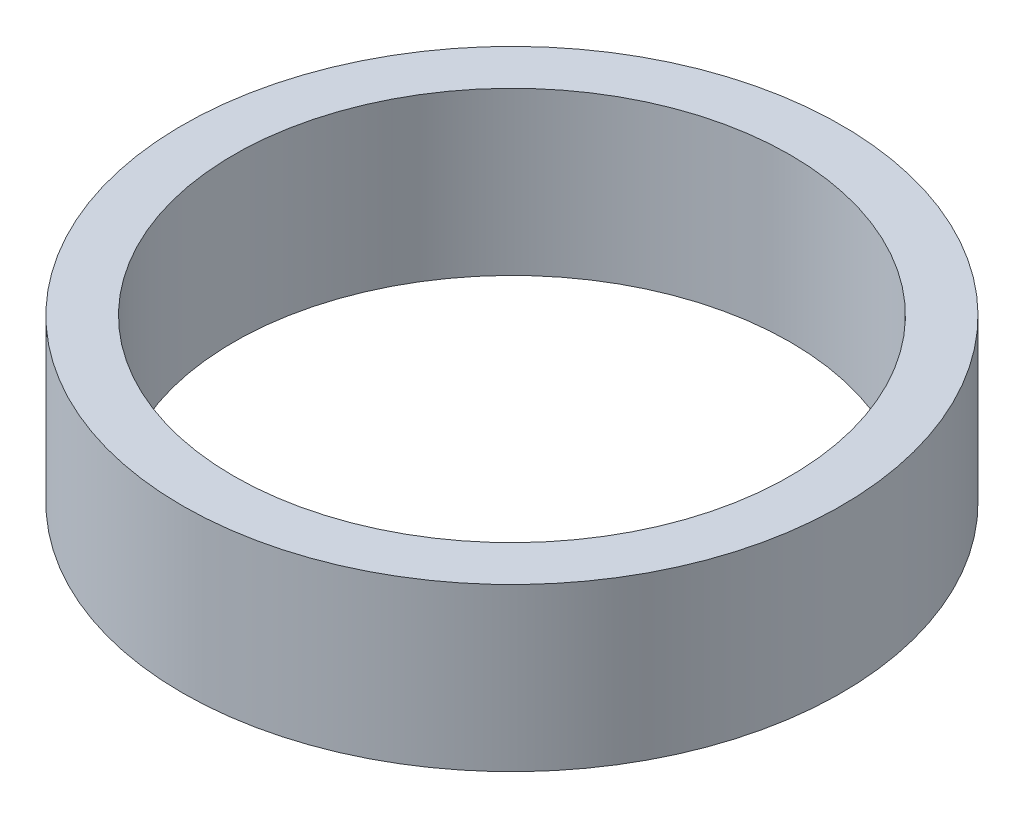
ISO-10303-21;
HEADER;
FILE_DESCRIPTION(('STEP AP214'),'2;1');
FILE_NAME('part.step','',(''),(''),'','','');
FILE_SCHEMA(('AUTOMOTIVE_DESIGN { 1 0 10303 214 1 1 1 1 }'));
ENDSEC;
DATA;
#1=APPLICATION_CONTEXT('core data for automotive mechanical design processes');
#2=APPLICATION_PROTOCOL_DEFINITION('international standard','automotive_design',2000,#1);
#3=PRODUCT_CONTEXT('',#1,'mechanical');
#4=PRODUCT('Part','Part','',(#3));
#5=PRODUCT_RELATED_PRODUCT_CATEGORY('part','',(#4));
#6=PRODUCT_DEFINITION_FORMATION('','',#4);
#7=PRODUCT_DEFINITION_CONTEXT('part definition',#1,'design');
#8=PRODUCT_DEFINITION('design','',#6,#7);
#9=PRODUCT_DEFINITION_SHAPE('','',#8);
#10=(LENGTH_UNIT() NAMED_UNIT(*) SI_UNIT(.MILLI.,.METRE.));
#11=(NAMED_UNIT(*) PLANE_ANGLE_UNIT() SI_UNIT($,.RADIAN.));
#12=(NAMED_UNIT(*) SI_UNIT($,.STERADIAN.) SOLID_ANGLE_UNIT());
#13=UNCERTAINTY_MEASURE_WITH_UNIT(LENGTH_MEASURE(1.E-05),#10,'distance_accuracy_value','');
#14=(GEOMETRIC_REPRESENTATION_CONTEXT(3) GLOBAL_UNCERTAINTY_ASSIGNED_CONTEXT((#13)) GLOBAL_UNIT_ASSIGNED_CONTEXT((#10,
#11,#12)) REPRESENTATION_CONTEXT('',''));
#15=CARTESIAN_POINT('',(0.,0.,0.));
#16=DIRECTION('',(0.,0.,1.));
#17=DIRECTION('',(1.,0.,0.));
#18=AXIS2_PLACEMENT_3D('',#15,#16,#17);
#19=CARTESIAN_POINT('',(0.,3.,0.));
#20=DIRECTION('',(0.,1.,0.));
#21=DIRECTION('',(0.,0.,1.));
#22=AXIS2_PLACEMENT_3D('',#19,#20,#21);
#23=PLANE('',#22);
#24=CARTESIAN_POINT('',(0.,3.,0.));
#25=DIRECTION('',(0.,1.,0.));
#26=DIRECTION('',(0.,0.,1.));
#27=AXIS2_PLACEMENT_3D('',#24,#25,#26);
#28=CIRCLE('',#27,6.1);
#29=CARTESIAN_POINT('',(0.,3.,6.1));
#30=VERTEX_POINT('',#29);
#31=EDGE_CURVE('E10',#30,#30,#28,.T.);
#32=ORIENTED_EDGE('',*,*,#31,.T.);
#33=EDGE_LOOP('',(#32));
#34=FACE_BOUND('',#33,.T.);
#35=CARTESIAN_POINT('',(0.,3.,0.));
#36=DIRECTION('',(0.,1.,0.));
#37=DIRECTION('',(0.,0.,1.));
#38=AXIS2_PLACEMENT_3D('',#35,#36,#37);
#39=CIRCLE('',#38,5.15);
#40=CARTESIAN_POINT('',(0.,3.,5.15));
#41=VERTEX_POINT('',#40);
#42=EDGE_CURVE('E48',#41,#41,#39,.T.);
#43=ORIENTED_EDGE('',*,*,#42,.F.);
#44=EDGE_LOOP('',(#43));
#45=FACE_BOUND('',#44,.T.);
#46=ADVANCED_FACE('F37',(#34,#45),#23,.T.);
#47=CARTESIAN_POINT('',(0.,0.,0.));
#48=DIRECTION('',(0.,1.,0.));
#49=DIRECTION('',(0.,0.,1.));
#50=AXIS2_PLACEMENT_3D('',#47,#48,#49);
#51=PLANE('',#50);
#52=CARTESIAN_POINT('',(0.,0.,0.));
#53=DIRECTION('',(0.,1.,0.));
#54=DIRECTION('',(0.,0.,1.));
#55=AXIS2_PLACEMENT_3D('',#52,#53,#54);
#56=CIRCLE('',#55,6.1);
#57=CARTESIAN_POINT('',(0.,0.,6.1));
#58=VERTEX_POINT('',#57);
#59=EDGE_CURVE('E41',#58,#58,#56,.T.);
#60=ORIENTED_EDGE('',*,*,#59,.F.);
#61=EDGE_LOOP('',(#60));
#62=FACE_BOUND('',#61,.T.);
#63=CARTESIAN_POINT('',(0.,0.,0.));
#64=DIRECTION('',(0.,1.,0.));
#65=DIRECTION('',(0.,0.,1.));
#66=AXIS2_PLACEMENT_3D('',#63,#64,#65);
#67=CIRCLE('',#66,5.15);
#68=CARTESIAN_POINT('',(0.,0.,5.15));
#69=VERTEX_POINT('',#68);
#70=EDGE_CURVE('E50',#69,#69,#67,.T.);
#71=ORIENTED_EDGE('',*,*,#70,.T.);
#72=EDGE_LOOP('',(#71));
#73=FACE_BOUND('',#72,.T.);
#74=ADVANCED_FACE('F60',(#62,#73),#51,.F.);
#75=CARTESIAN_POINT('',(0.,3.,0.));
#76=DIRECTION('',(0.,-1.,0.));
#77=DIRECTION('',(0.,0.,-1.));
#78=AXIS2_PLACEMENT_3D('',#75,#76,#77);
#79=CYLINDRICAL_SURFACE('',#78,6.1);
#80=ORIENTED_EDGE('',*,*,#31,.F.);
#81=EDGE_LOOP('',(#80));
#82=FACE_BOUND('',#81,.T.);
#83=ORIENTED_EDGE('',*,*,#59,.T.);
#84=EDGE_LOOP('',(#83));
#85=FACE_BOUND('',#84,.T.);
#86=ADVANCED_FACE('F39',(#82,#85),#79,.T.);
#87=CARTESIAN_POINT('',(0.,3.,0.));
#88=DIRECTION('',(0.,-1.,0.));
#89=DIRECTION('',(0.,0.,-1.));
#90=AXIS2_PLACEMENT_3D('',#87,#88,#89);
#91=CYLINDRICAL_SURFACE('',#90,5.15);
#92=ORIENTED_EDGE('',*,*,#42,.T.);
#93=EDGE_LOOP('',(#92));
#94=FACE_BOUND('',#93,.T.);
#95=ORIENTED_EDGE('',*,*,#70,.F.);
#96=EDGE_LOOP('',(#95));
#97=FACE_BOUND('',#96,.T.);
#98=ADVANCED_FACE('F56',(#94,#97),#91,.F.);
#99=CLOSED_SHELL('',(#46,#74,#86,#98));
#100=MANIFOLD_SOLID_BREP('B2',#99);
#101=ADVANCED_BREP_SHAPE_REPRESENTATION('',(#18,#100),#14);
#102=SHAPE_DEFINITION_REPRESENTATION(#9,#101);
ENDSEC;
END-ISO-10303-21;
